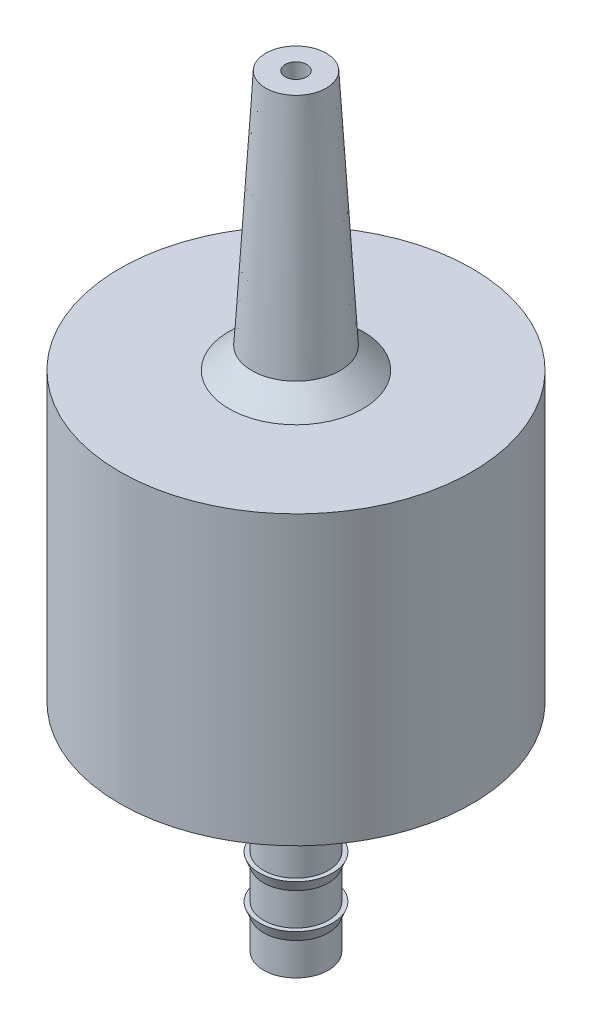
ISO-10303-21;
HEADER;
FILE_DESCRIPTION(('STEP AP214'),'2;1');
FILE_NAME('part.step','',(''),(''),'','','');
FILE_SCHEMA(('AUTOMOTIVE_DESIGN { 1 0 10303 214 1 1 1 1 }'));
ENDSEC;
DATA;
#1=APPLICATION_CONTEXT('core data for automotive mechanical design processes');
#2=APPLICATION_PROTOCOL_DEFINITION('international standard','automotive_design',2000,#1);
#3=PRODUCT_CONTEXT('',#1,'mechanical');
#4=PRODUCT('Part','Part','',(#3));
#5=PRODUCT_RELATED_PRODUCT_CATEGORY('part','',(#4));
#6=PRODUCT_DEFINITION_FORMATION('','',#4);
#7=PRODUCT_DEFINITION_CONTEXT('part definition',#1,'design');
#8=PRODUCT_DEFINITION('design','',#6,#7);
#9=PRODUCT_DEFINITION_SHAPE('','',#8);
#10=(LENGTH_UNIT() NAMED_UNIT(*) SI_UNIT(.MILLI.,.METRE.));
#11=(NAMED_UNIT(*) PLANE_ANGLE_UNIT() SI_UNIT($,.RADIAN.));
#12=(NAMED_UNIT(*) SI_UNIT($,.STERADIAN.) SOLID_ANGLE_UNIT());
#13=UNCERTAINTY_MEASURE_WITH_UNIT(LENGTH_MEASURE(1.E-05),#10,'distance_accuracy_value','');
#14=(GEOMETRIC_REPRESENTATION_CONTEXT(3) GLOBAL_UNCERTAINTY_ASSIGNED_CONTEXT((#13)) GLOBAL_UNIT_ASSIGNED_CONTEXT((#10,
#11,#12)) REPRESENTATION_CONTEXT('',''));
#15=CARTESIAN_POINT('',(0.,0.,0.));
#16=DIRECTION('',(0.,0.,1.));
#17=DIRECTION('',(1.,0.,0.));
#18=AXIS2_PLACEMENT_3D('',#15,#16,#17);
#19=CARTESIAN_POINT('',(0.,0.,0.));
#20=DIRECTION('',(0.,-1.,0.));
#21=DIRECTION('',(0.,0.,-1.));
#22=AXIS2_PLACEMENT_3D('',#19,#20,#21);
#23=CONICAL_SURFACE('',#22,2.1,0.0582673029695333);
#24=CARTESIAN_POINT('',(0.,12.,0.));
#25=DIRECTION('',(0.,1.,0.));
#26=DIRECTION('',(0.,0.,1.));
#27=AXIS2_PLACEMENT_3D('',#24,#25,#26);
#28=CIRCLE('',#27,1.4);
#29=CARTESIAN_POINT('',(0.,12.,1.4));
#30=VERTEX_POINT('',#29);
#31=EDGE_CURVE('E57',#30,#30,#28,.T.);
#32=ORIENTED_EDGE('',*,*,#31,.F.);
#33=EDGE_LOOP('',(#32));
#34=FACE_BOUND('',#33,.T.);
#35=CARTESIAN_POINT('',(0.,0.998302940921257,0.));
#36=DIRECTION('',(0.,-1.,0.));
#37=DIRECTION('',(0.,0.,-1.));
#38=AXIS2_PLACEMENT_3D('',#35,#36,#37);
#39=CIRCLE('',#38,2.04176566177959);
#40=CARTESIAN_POINT('',(0.,0.998302940921257,-2.04176566177959));
#41=VERTEX_POINT('',#40);
#42=EDGE_CURVE('E10',#41,#41,#39,.T.);
#43=ORIENTED_EDGE('',*,*,#42,.F.);
#44=EDGE_LOOP('',(#43));
#45=FACE_BOUND('',#44,.T.);
#46=ADVANCED_FACE('F31',(#34,#45),#23,.T.);
#47=CARTESIAN_POINT('',(2.1,0.,0.));
#48=DIRECTION('',(0.,-1.,0.));
#49=DIRECTION('',(0.,0.,-1.));
#50=AXIS2_PLACEMENT_3D('',#47,#48,#49);
#51=PLANE('',#50);
#52=CARTESIAN_POINT('',(0.,0.,0.));
#53=DIRECTION('',(0.,1.,0.));
#54=DIRECTION('',(0.,0.,1.));
#55=AXIS2_PLACEMENT_3D('',#52,#53,#54);
#56=CIRCLE('',#55,8.15);
#57=CARTESIAN_POINT('',(0.,0.,8.15));
#58=VERTEX_POINT('',#57);
#59=EDGE_CURVE('E60',#58,#58,#56,.T.);
#60=ORIENTED_EDGE('',*,*,#59,.T.);
#61=EDGE_LOOP('',(#60));
#62=FACE_BOUND('',#61,.T.);
#63=CARTESIAN_POINT('',(0.,0.,0.));
#64=DIRECTION('',(0.,-1.,0.));
#65=DIRECTION('',(0.,0.,-1.));
#66=AXIS2_PLACEMENT_3D('',#63,#64,#65);
#67=CIRCLE('',#66,3.1);
#68=CARTESIAN_POINT('',(0.,0.,-3.1));
#69=VERTEX_POINT('',#68);
#70=EDGE_CURVE('E38',#69,#69,#67,.F.);
#71=ORIENTED_EDGE('',*,*,#70,.F.);
#72=EDGE_LOOP('',(#71));
#73=FACE_BOUND('',#72,.T.);
#74=ADVANCED_FACE('F130',(#62,#73),#51,.F.);
#75=CARTESIAN_POINT('',(0.,23.0580795282157,0.));
#76=DIRECTION('',(0.,1.,0.));
#77=DIRECTION('',(0.,0.,1.));
#78=AXIS2_PLACEMENT_3D('',#75,#76,#77);
#79=CYLINDRICAL_SURFACE('',#78,1.5);
#80=CARTESIAN_POINT('',(0.,-15.3,0.));
#81=DIRECTION('',(0.,1.,0.));
#82=DIRECTION('',(0.,0.,1.));
#83=AXIS2_PLACEMENT_3D('',#80,#81,#82);
#84=CIRCLE('',#83,1.5);
#85=CARTESIAN_POINT('',(0.,-15.3,1.5));
#86=VERTEX_POINT('',#85);
#87=EDGE_CURVE('E66',#86,#86,#84,.T.);
#88=ORIENTED_EDGE('',*,*,#87,.T.);
#89=EDGE_LOOP('',(#88));
#90=FACE_BOUND('',#89,.T.);
#91=CARTESIAN_POINT('',(0.,-14.8,0.));
#92=DIRECTION('',(0.,1.,0.));
#93=DIRECTION('',(0.,0.,1.));
#94=AXIS2_PLACEMENT_3D('',#91,#92,#93);
#95=CIRCLE('',#94,1.5);
#96=CARTESIAN_POINT('',(0.,-14.8,1.5));
#97=VERTEX_POINT('',#96);
#98=EDGE_CURVE('E46',#97,#97,#95,.T.);
#99=ORIENTED_EDGE('',*,*,#98,.F.);
#100=EDGE_LOOP('',(#99));
#101=FACE_BOUND('',#100,.T.);
#102=ADVANCED_FACE('F114',(#90,#101),#79,.T.);
#103=CARTESIAN_POINT('',(0.,0.,0.));
#104=DIRECTION('',(0.,1.,0.));
#105=DIRECTION('',(0.,0.,1.));
#106=AXIS2_PLACEMENT_3D('',#103,#104,#105);
#107=CONICAL_SURFACE('',#106,1.25,0.0107292020148093);
#108=CARTESIAN_POINT('',(0.,-23.3,0.));
#109=DIRECTION('',(0.,1.,0.));
#110=DIRECTION('',(0.,0.,1.));
#111=AXIS2_PLACEMENT_3D('',#108,#109,#110);
#112=CIRCLE('',#111,1.);
#113=CARTESIAN_POINT('',(0.,-23.3,1.));
#114=VERTEX_POINT('',#113);
#115=EDGE_CURVE('E105',#114,#114,#112,.T.);
#116=ORIENTED_EDGE('',*,*,#115,.F.);
#117=EDGE_LOOP('',(#116));
#118=FACE_BOUND('',#117,.T.);
#119=CARTESIAN_POINT('',(0.,0.,0.));
#120=DIRECTION('',(0.,1.,0.));
#121=DIRECTION('',(0.,0.,1.));
#122=AXIS2_PLACEMENT_3D('',#119,#120,#121);
#123=CIRCLE('',#122,1.25);
#124=CARTESIAN_POINT('',(0.,0.,1.25));
#125=VERTEX_POINT('',#124);
#126=EDGE_CURVE('E51',#125,#125,#123,.T.);
#127=ORIENTED_EDGE('',*,*,#126,.T.);
#128=EDGE_LOOP('',(#127));
#129=FACE_BOUND('',#128,.T.);
#130=ADVANCED_FACE('F33',(#118,#129),#107,.F.);
#131=CARTESIAN_POINT('',(0.,12.,0.));
#132=DIRECTION('',(0.,-1.,0.));
#133=DIRECTION('',(0.,0.,-1.));
#134=AXIS2_PLACEMENT_3D('',#131,#132,#133);
#135=CONICAL_SURFACE('',#134,0.500000000000001,0.0624188099959573);
#136=ORIENTED_EDGE('',*,*,#126,.F.);
#137=EDGE_LOOP('',(#136));
#138=FACE_BOUND('',#137,.T.);
#139=CARTESIAN_POINT('',(0.,12.,0.));
#140=DIRECTION('',(0.,1.,0.));
#141=DIRECTION('',(0.,0.,1.));
#142=AXIS2_PLACEMENT_3D('',#139,#140,#141);
#143=CIRCLE('',#142,0.500000000000001);
#144=CARTESIAN_POINT('',(0.,12.,0.500000000000001));
#145=VERTEX_POINT('',#144);
#146=EDGE_CURVE('E54',#145,#145,#143,.T.);
#147=ORIENTED_EDGE('',*,*,#146,.T.);
#148=EDGE_LOOP('',(#147));
#149=FACE_BOUND('',#148,.T.);
#150=ADVANCED_FACE('F113',(#138,#149),#135,.F.);
#151=CARTESIAN_POINT('',(0.500000000000001,12.,0.));
#152=DIRECTION('',(0.,-1.,0.));
#153=DIRECTION('',(0.,0.,-1.));
#154=AXIS2_PLACEMENT_3D('',#151,#152,#153);
#155=PLANE('',#154);
#156=ORIENTED_EDGE('',*,*,#146,.F.);
#157=EDGE_LOOP('',(#156));
#158=FACE_BOUND('',#157,.T.);
#159=ORIENTED_EDGE('',*,*,#31,.T.);
#160=EDGE_LOOP('',(#159));
#161=FACE_BOUND('',#160,.T.);
#162=ADVANCED_FACE('F119',(#158,#161),#155,.F.);
#163=CARTESIAN_POINT('',(0.,23.0580795282157,0.));
#164=DIRECTION('',(0.,1.,0.));
#165=DIRECTION('',(0.,0.,1.));
#166=AXIS2_PLACEMENT_3D('',#163,#164,#165);
#167=CYLINDRICAL_SURFACE('',#166,8.15);
#168=ORIENTED_EDGE('',*,*,#59,.F.);
#169=EDGE_LOOP('',(#168));
#170=FACE_BOUND('',#169,.T.);
#171=CARTESIAN_POINT('',(0.,-13.3,0.));
#172=DIRECTION('',(0.,1.,0.));
#173=DIRECTION('',(0.,0.,1.));
#174=AXIS2_PLACEMENT_3D('',#171,#172,#173);
#175=CIRCLE('',#174,8.15);
#176=CARTESIAN_POINT('',(0.,-13.3,8.15));
#177=VERTEX_POINT('',#176);
#178=EDGE_CURVE('E63',#177,#177,#175,.T.);
#179=ORIENTED_EDGE('',*,*,#178,.T.);
#180=EDGE_LOOP('',(#179));
#181=FACE_BOUND('',#180,.T.);
#182=ADVANCED_FACE('F124',(#170,#181),#167,.T.);
#183=CARTESIAN_POINT('',(1.5,-13.3,0.));
#184=DIRECTION('',(0.,1.,0.));
#185=DIRECTION('',(0.,0.,1.));
#186=AXIS2_PLACEMENT_3D('',#183,#184,#185);
#187=PLANE('',#186);
#188=CARTESIAN_POINT('',(0.,-13.3,0.));
#189=DIRECTION('',(0.,1.,0.));
#190=DIRECTION('',(0.,0.,1.));
#191=AXIS2_PLACEMENT_3D('',#188,#189,#190);
#192=CIRCLE('',#191,2.5);
#193=CARTESIAN_POINT('',(0.,-13.3,2.5));
#194=VERTEX_POINT('',#193);
#195=EDGE_CURVE('E42',#194,#194,#192,.F.);
#196=ORIENTED_EDGE('',*,*,#195,.F.);
#197=EDGE_LOOP('',(#196));
#198=FACE_BOUND('',#197,.T.);
#199=ORIENTED_EDGE('',*,*,#178,.F.);
#200=EDGE_LOOP('',(#199));
#201=FACE_BOUND('',#200,.T.);
#202=ADVANCED_FACE('F140',(#198,#201),#187,.F.);
#203=CARTESIAN_POINT('',(1.5,-15.3,0.));
#204=DIRECTION('',(0.,-1.,0.));
#205=DIRECTION('',(0.,0.,-1.));
#206=AXIS2_PLACEMENT_3D('',#203,#204,#205);
#207=PLANE('',#206);
#208=ORIENTED_EDGE('',*,*,#87,.F.);
#209=EDGE_LOOP('',(#208));
#210=FACE_BOUND('',#209,.T.);
#211=CARTESIAN_POINT('',(0.,-15.3,0.));
#212=DIRECTION('',(0.,1.,0.));
#213=DIRECTION('',(0.,0.,1.));
#214=AXIS2_PLACEMENT_3D('',#211,#212,#213);
#215=CIRCLE('',#214,1.7);
#216=CARTESIAN_POINT('',(0.,-15.3,1.7));
#217=VERTEX_POINT('',#216);
#218=EDGE_CURVE('E69',#217,#217,#215,.T.);
#219=ORIENTED_EDGE('',*,*,#218,.T.);
#220=EDGE_LOOP('',(#219));
#221=FACE_BOUND('',#220,.T.);
#222=ADVANCED_FACE('F144',(#210,#221),#207,.F.);
#223=CARTESIAN_POINT('',(0.,-15.8,0.));
#224=DIRECTION('',(0.,1.,0.));
#225=DIRECTION('',(0.,0.,1.));
#226=AXIS2_PLACEMENT_3D('',#223,#224,#225);
#227=CONICAL_SURFACE('',#226,1.5,0.380506377112365);
#228=ORIENTED_EDGE('',*,*,#218,.F.);
#229=EDGE_LOOP('',(#228));
#230=FACE_BOUND('',#229,.T.);
#231=CARTESIAN_POINT('',(0.,-15.8,0.));
#232=DIRECTION('',(0.,1.,0.));
#233=DIRECTION('',(0.,0.,1.));
#234=AXIS2_PLACEMENT_3D('',#231,#232,#233);
#235=CIRCLE('',#234,1.5);
#236=CARTESIAN_POINT('',(0.,-15.8,1.5));
#237=VERTEX_POINT('',#236);
#238=EDGE_CURVE('E72',#237,#237,#235,.T.);
#239=ORIENTED_EDGE('',*,*,#238,.T.);
#240=EDGE_LOOP('',(#239));
#241=FACE_BOUND('',#240,.T.);
#242=ADVANCED_FACE('F151',(#230,#241),#227,.T.);
#243=CARTESIAN_POINT('',(0.,23.0580795282157,0.));
#244=DIRECTION('',(0.,1.,0.));
#245=DIRECTION('',(0.,0.,1.));
#246=AXIS2_PLACEMENT_3D('',#243,#244,#245);
#247=CYLINDRICAL_SURFACE('',#246,1.5);
#248=ORIENTED_EDGE('',*,*,#238,.F.);
#249=EDGE_LOOP('',(#248));
#250=FACE_BOUND('',#249,.T.);
#251=CARTESIAN_POINT('',(0.,-17.3,0.));
#252=DIRECTION('',(0.,1.,0.));
#253=DIRECTION('',(0.,0.,1.));
#254=AXIS2_PLACEMENT_3D('',#251,#252,#253);
#255=CIRCLE('',#254,1.5);
#256=CARTESIAN_POINT('',(0.,-17.3,1.5));
#257=VERTEX_POINT('',#256);
#258=EDGE_CURVE('E75',#257,#257,#255,.T.);
#259=ORIENTED_EDGE('',*,*,#258,.T.);
#260=EDGE_LOOP('',(#259));
#261=FACE_BOUND('',#260,.T.);
#262=ADVANCED_FACE('F155',(#250,#261),#247,.T.);
#263=CARTESIAN_POINT('',(1.5,-17.3,0.));
#264=DIRECTION('',(0.,-1.,0.));
#265=DIRECTION('',(0.,0.,-1.));
#266=AXIS2_PLACEMENT_3D('',#263,#264,#265);
#267=PLANE('',#266);
#268=ORIENTED_EDGE('',*,*,#258,.F.);
#269=EDGE_LOOP('',(#268));
#270=FACE_BOUND('',#269,.T.);
#271=CARTESIAN_POINT('',(0.,-17.3,0.));
#272=DIRECTION('',(0.,1.,0.));
#273=DIRECTION('',(0.,0.,1.));
#274=AXIS2_PLACEMENT_3D('',#271,#272,#273);
#275=CIRCLE('',#274,1.7);
#276=CARTESIAN_POINT('',(0.,-17.3,1.7));
#277=VERTEX_POINT('',#276);
#278=EDGE_CURVE('E78',#277,#277,#275,.T.);
#279=ORIENTED_EDGE('',*,*,#278,.T.);
#280=EDGE_LOOP('',(#279));
#281=FACE_BOUND('',#280,.T.);
#282=ADVANCED_FACE('F159',(#270,#281),#267,.F.);
#283=CARTESIAN_POINT('',(0.,-17.8,0.));
#284=DIRECTION('',(0.,1.,0.));
#285=DIRECTION('',(0.,0.,1.));
#286=AXIS2_PLACEMENT_3D('',#283,#284,#285);
#287=CONICAL_SURFACE('',#286,1.5,0.380506377112365);
#288=ORIENTED_EDGE('',*,*,#278,.F.);
#289=EDGE_LOOP('',(#288));
#290=FACE_BOUND('',#289,.T.);
#291=CARTESIAN_POINT('',(0.,-17.8,0.));
#292=DIRECTION('',(0.,1.,0.));
#293=DIRECTION('',(0.,0.,1.));
#294=AXIS2_PLACEMENT_3D('',#291,#292,#293);
#295=CIRCLE('',#294,1.5);
#296=CARTESIAN_POINT('',(0.,-17.8,1.5));
#297=VERTEX_POINT('',#296);
#298=EDGE_CURVE('E81',#297,#297,#295,.T.);
#299=ORIENTED_EDGE('',*,*,#298,.T.);
#300=EDGE_LOOP('',(#299));
#301=FACE_BOUND('',#300,.T.);
#302=ADVANCED_FACE('F163',(#290,#301),#287,.T.);
#303=CARTESIAN_POINT('',(0.,23.0580795282157,0.));
#304=DIRECTION('',(0.,1.,0.));
#305=DIRECTION('',(0.,0.,1.));
#306=AXIS2_PLACEMENT_3D('',#303,#304,#305);
#307=CYLINDRICAL_SURFACE('',#306,1.5);
#308=ORIENTED_EDGE('',*,*,#298,.F.);
#309=EDGE_LOOP('',(#308));
#310=FACE_BOUND('',#309,.T.);
#311=CARTESIAN_POINT('',(0.,-19.3,0.));
#312=DIRECTION('',(0.,1.,0.));
#313=DIRECTION('',(0.,0.,1.));
#314=AXIS2_PLACEMENT_3D('',#311,#312,#313);
#315=CIRCLE('',#314,1.5);
#316=CARTESIAN_POINT('',(0.,-19.3,1.5));
#317=VERTEX_POINT('',#316);
#318=EDGE_CURVE('E84',#317,#317,#315,.T.);
#319=ORIENTED_EDGE('',*,*,#318,.T.);
#320=EDGE_LOOP('',(#319));
#321=FACE_BOUND('',#320,.T.);
#322=ADVANCED_FACE('F167',(#310,#321),#307,.T.);
#323=CARTESIAN_POINT('',(1.5,-19.3,0.));
#324=DIRECTION('',(0.,-1.,0.));
#325=DIRECTION('',(0.,0.,-1.));
#326=AXIS2_PLACEMENT_3D('',#323,#324,#325);
#327=PLANE('',#326);
#328=ORIENTED_EDGE('',*,*,#318,.F.);
#329=EDGE_LOOP('',(#328));
#330=FACE_BOUND('',#329,.T.);
#331=CARTESIAN_POINT('',(0.,-19.3,0.));
#332=DIRECTION('',(0.,1.,0.));
#333=DIRECTION('',(0.,0.,1.));
#334=AXIS2_PLACEMENT_3D('',#331,#332,#333);
#335=CIRCLE('',#334,1.7);
#336=CARTESIAN_POINT('',(0.,-19.3,1.7));
#337=VERTEX_POINT('',#336);
#338=EDGE_CURVE('E87',#337,#337,#335,.T.);
#339=ORIENTED_EDGE('',*,*,#338,.T.);
#340=EDGE_LOOP('',(#339));
#341=FACE_BOUND('',#340,.T.);
#342=ADVANCED_FACE('F171',(#330,#341),#327,.F.);
#343=CARTESIAN_POINT('',(0.,-19.8,0.));
#344=DIRECTION('',(0.,1.,0.));
#345=DIRECTION('',(0.,0.,1.));
#346=AXIS2_PLACEMENT_3D('',#343,#344,#345);
#347=CONICAL_SURFACE('',#346,1.5,0.380506377112365);
#348=ORIENTED_EDGE('',*,*,#338,.F.);
#349=EDGE_LOOP('',(#348));
#350=FACE_BOUND('',#349,.T.);
#351=CARTESIAN_POINT('',(0.,-19.8,0.));
#352=DIRECTION('',(0.,1.,0.));
#353=DIRECTION('',(0.,0.,1.));
#354=AXIS2_PLACEMENT_3D('',#351,#352,#353);
#355=CIRCLE('',#354,1.5);
#356=CARTESIAN_POINT('',(0.,-19.8,1.5));
#357=VERTEX_POINT('',#356);
#358=EDGE_CURVE('E90',#357,#357,#355,.T.);
#359=ORIENTED_EDGE('',*,*,#358,.T.);
#360=EDGE_LOOP('',(#359));
#361=FACE_BOUND('',#360,.T.);
#362=ADVANCED_FACE('F175',(#350,#361),#347,.T.);
#363=CARTESIAN_POINT('',(0.,23.0580795282157,0.));
#364=DIRECTION('',(0.,1.,0.));
#365=DIRECTION('',(0.,0.,1.));
#366=AXIS2_PLACEMENT_3D('',#363,#364,#365);
#367=CYLINDRICAL_SURFACE('',#366,1.5);
#368=ORIENTED_EDGE('',*,*,#358,.F.);
#369=EDGE_LOOP('',(#368));
#370=FACE_BOUND('',#369,.T.);
#371=CARTESIAN_POINT('',(0.,-21.3,0.));
#372=DIRECTION('',(0.,1.,0.));
#373=DIRECTION('',(0.,0.,1.));
#374=AXIS2_PLACEMENT_3D('',#371,#372,#373);
#375=CIRCLE('',#374,1.5);
#376=CARTESIAN_POINT('',(0.,-21.3,1.5));
#377=VERTEX_POINT('',#376);
#378=EDGE_CURVE('E93',#377,#377,#375,.T.);
#379=ORIENTED_EDGE('',*,*,#378,.T.);
#380=EDGE_LOOP('',(#379));
#381=FACE_BOUND('',#380,.T.);
#382=ADVANCED_FACE('F179',(#370,#381),#367,.T.);
#383=CARTESIAN_POINT('',(1.5,-21.3,0.));
#384=DIRECTION('',(0.,-1.,0.));
#385=DIRECTION('',(0.,0.,-1.));
#386=AXIS2_PLACEMENT_3D('',#383,#384,#385);
#387=PLANE('',#386);
#388=ORIENTED_EDGE('',*,*,#378,.F.);
#389=EDGE_LOOP('',(#388));
#390=FACE_BOUND('',#389,.T.);
#391=CARTESIAN_POINT('',(0.,-21.3,0.));
#392=DIRECTION('',(0.,1.,0.));
#393=DIRECTION('',(0.,0.,1.));
#394=AXIS2_PLACEMENT_3D('',#391,#392,#393);
#395=CIRCLE('',#394,1.7);
#396=CARTESIAN_POINT('',(0.,-21.3,1.7));
#397=VERTEX_POINT('',#396);
#398=EDGE_CURVE('E96',#397,#397,#395,.T.);
#399=ORIENTED_EDGE('',*,*,#398,.T.);
#400=EDGE_LOOP('',(#399));
#401=FACE_BOUND('',#400,.T.);
#402=ADVANCED_FACE('F183',(#390,#401),#387,.F.);
#403=CARTESIAN_POINT('',(0.,-21.8,0.));
#404=DIRECTION('',(0.,1.,0.));
#405=DIRECTION('',(0.,0.,1.));
#406=AXIS2_PLACEMENT_3D('',#403,#404,#405);
#407=CONICAL_SURFACE('',#406,1.5,0.380506377112365);
#408=ORIENTED_EDGE('',*,*,#398,.F.);
#409=EDGE_LOOP('',(#408));
#410=FACE_BOUND('',#409,.T.);
#411=CARTESIAN_POINT('',(0.,-21.8,0.));
#412=DIRECTION('',(0.,1.,0.));
#413=DIRECTION('',(0.,0.,1.));
#414=AXIS2_PLACEMENT_3D('',#411,#412,#413);
#415=CIRCLE('',#414,1.5);
#416=CARTESIAN_POINT('',(0.,-21.8,1.5));
#417=VERTEX_POINT('',#416);
#418=EDGE_CURVE('E99',#417,#417,#415,.T.);
#419=ORIENTED_EDGE('',*,*,#418,.T.);
#420=EDGE_LOOP('',(#419));
#421=FACE_BOUND('',#420,.T.);
#422=ADVANCED_FACE('F187',(#410,#421),#407,.T.);
#423=CARTESIAN_POINT('',(0.,23.0580795282157,0.));
#424=DIRECTION('',(0.,1.,0.));
#425=DIRECTION('',(0.,0.,1.));
#426=AXIS2_PLACEMENT_3D('',#423,#424,#425);
#427=CYLINDRICAL_SURFACE('',#426,1.5);
#428=ORIENTED_EDGE('',*,*,#418,.F.);
#429=EDGE_LOOP('',(#428));
#430=FACE_BOUND('',#429,.T.);
#431=CARTESIAN_POINT('',(0.,-23.3,0.));
#432=DIRECTION('',(0.,1.,0.));
#433=DIRECTION('',(0.,0.,1.));
#434=AXIS2_PLACEMENT_3D('',#431,#432,#433);
#435=CIRCLE('',#434,1.5);
#436=CARTESIAN_POINT('',(0.,-23.3,1.5));
#437=VERTEX_POINT('',#436);
#438=EDGE_CURVE('E102',#437,#437,#435,.T.);
#439=ORIENTED_EDGE('',*,*,#438,.T.);
#440=EDGE_LOOP('',(#439));
#441=FACE_BOUND('',#440,.T.);
#442=ADVANCED_FACE('F191',(#430,#441),#427,.T.);
#443=CARTESIAN_POINT('',(1.,-23.3,0.));
#444=DIRECTION('',(0.,1.,0.));
#445=DIRECTION('',(0.,0.,1.));
#446=AXIS2_PLACEMENT_3D('',#443,#444,#445);
#447=PLANE('',#446);
#448=ORIENTED_EDGE('',*,*,#438,.F.);
#449=EDGE_LOOP('',(#448));
#450=FACE_BOUND('',#449,.T.);
#451=ORIENTED_EDGE('',*,*,#115,.T.);
#452=EDGE_LOOP('',(#451));
#453=FACE_BOUND('',#452,.T.);
#454=ADVANCED_FACE('F109',(#450,#453),#447,.F.);
#455=CARTESIAN_POINT('',(0.,-14.8,0.));
#456=DIRECTION('',(0.,1.,0.));
#457=DIRECTION('',(0.,0.,1.));
#458=AXIS2_PLACEMENT_3D('',#455,#456,#457);
#459=CONICAL_SURFACE('',#458,1.5,0.588002603547567);
#460=ORIENTED_EDGE('',*,*,#195,.T.);
#461=EDGE_LOOP('',(#460));
#462=FACE_BOUND('',#461,.T.);
#463=ORIENTED_EDGE('',*,*,#98,.T.);
#464=EDGE_LOOP('',(#463));
#465=FACE_BOUND('',#464,.T.);
#466=ADVANCED_FACE('F198',(#462,#465),#459,.T.);
#467=CARTESIAN_POINT('',(0.,0.,0.));
#468=DIRECTION('',(0.,-1.,0.));
#469=DIRECTION('',(0.,0.,-1.));
#470=AXIS2_PLACEMENT_3D('',#467,#468,#469);
#471=CONICAL_SURFACE('',#470,3.1,0.814531814882215);
#472=ORIENTED_EDGE('',*,*,#42,.T.);
#473=EDGE_LOOP('',(#472));
#474=FACE_BOUND('',#473,.T.);
#475=ORIENTED_EDGE('',*,*,#70,.T.);
#476=EDGE_LOOP('',(#475));
#477=FACE_BOUND('',#476,.T.);
#478=ADVANCED_FACE('F202',(#474,#477),#471,.T.);
#479=CLOSED_SHELL('',(#46,#74,#102,#130,#150,#162,#182,#202,#222,#242,#262,#282,#302,#322,#342,
#362,#382,#402,#422,#442,#454,#466,#478));
#480=MANIFOLD_SOLID_BREP('B2',#479);
#481=ADVANCED_BREP_SHAPE_REPRESENTATION('',(#18,#480),#14);
#482=SHAPE_DEFINITION_REPRESENTATION(#9,#481);
ENDSEC;
END-ISO-10303-21;
